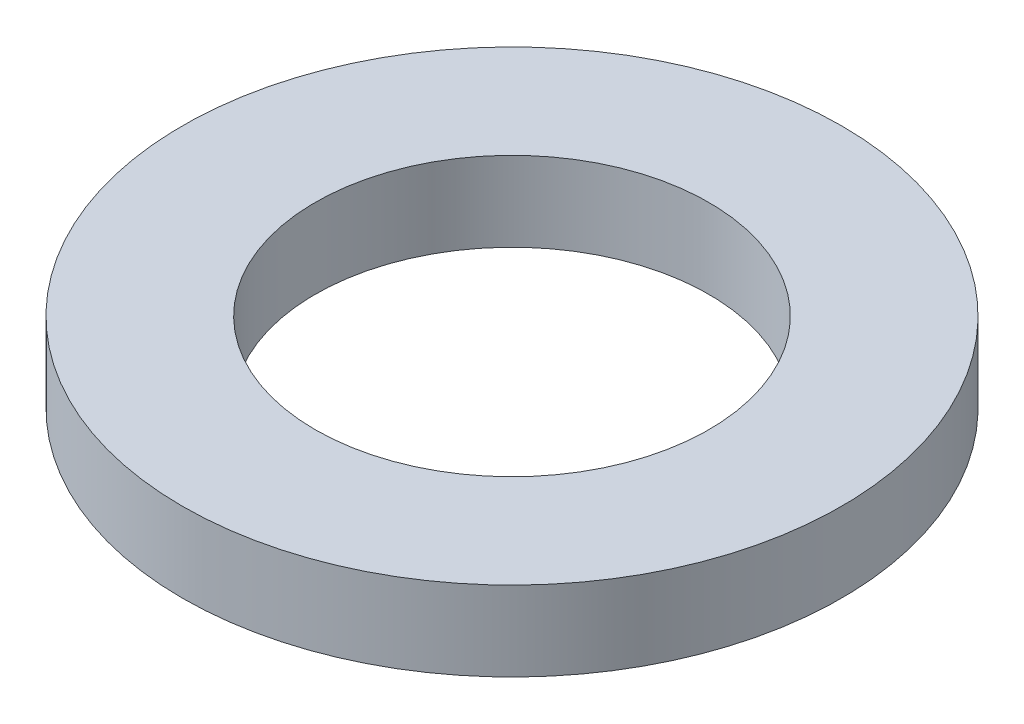
ISO-10303-21;
HEADER;
FILE_DESCRIPTION(('STEP AP214'),'2;1');
FILE_NAME('part.step','',(''),(''),'','','');
FILE_SCHEMA(('AUTOMOTIVE_DESIGN { 1 0 10303 214 1 1 1 1 }'));
ENDSEC;
DATA;
#1=APPLICATION_CONTEXT('core data for automotive mechanical design processes');
#2=APPLICATION_PROTOCOL_DEFINITION('international standard','automotive_design',2000,#1);
#3=PRODUCT_CONTEXT('',#1,'mechanical');
#4=PRODUCT('Part','Part','',(#3));
#5=PRODUCT_RELATED_PRODUCT_CATEGORY('part','',(#4));
#6=PRODUCT_DEFINITION_FORMATION('','',#4);
#7=PRODUCT_DEFINITION_CONTEXT('part definition',#1,'design');
#8=PRODUCT_DEFINITION('design','',#6,#7);
#9=PRODUCT_DEFINITION_SHAPE('','',#8);
#10=(LENGTH_UNIT() NAMED_UNIT(*) SI_UNIT(.MILLI.,.METRE.));
#11=(NAMED_UNIT(*) PLANE_ANGLE_UNIT() SI_UNIT($,.RADIAN.));
#12=(NAMED_UNIT(*) SI_UNIT($,.STERADIAN.) SOLID_ANGLE_UNIT());
#13=UNCERTAINTY_MEASURE_WITH_UNIT(LENGTH_MEASURE(1.E-05),#10,'distance_accuracy_value','');
#14=(GEOMETRIC_REPRESENTATION_CONTEXT(3) GLOBAL_UNCERTAINTY_ASSIGNED_CONTEXT((#13)) GLOBAL_UNIT_ASSIGNED_CONTEXT((#10,
#11,#12)) REPRESENTATION_CONTEXT('',''));
#15=CARTESIAN_POINT('',(0.,0.,0.));
#16=DIRECTION('',(0.,0.,1.));
#17=DIRECTION('',(1.,0.,0.));
#18=AXIS2_PLACEMENT_3D('',#15,#16,#17);
#19=CARTESIAN_POINT('',(0.,0.4572,0.));
#20=DIRECTION('',(0.,-1.,0.));
#21=DIRECTION('',(0.,0.,-1.));
#22=AXIS2_PLACEMENT_3D('',#19,#20,#21);
#23=CYLINDRICAL_SURFACE('',#22,1.8923);
#24=CARTESIAN_POINT('',(0.,0.4572,0.));
#25=DIRECTION('',(0.,1.,0.));
#26=DIRECTION('',(0.,0.,1.));
#27=AXIS2_PLACEMENT_3D('',#24,#25,#26);
#28=CIRCLE('',#27,1.8923);
#29=CARTESIAN_POINT('',(0.,0.4572,1.8923));
#30=VERTEX_POINT('',#29);
#31=EDGE_CURVE('E10',#30,#30,#28,.T.);
#32=ORIENTED_EDGE('',*,*,#31,.F.);
#33=EDGE_LOOP('',(#32));
#34=FACE_BOUND('',#33,.T.);
#35=CARTESIAN_POINT('',(0.,0.,0.));
#36=DIRECTION('',(0.,1.,0.));
#37=DIRECTION('',(0.,0.,1.));
#38=AXIS2_PLACEMENT_3D('',#35,#36,#37);
#39=CIRCLE('',#38,1.8923);
#40=CARTESIAN_POINT('',(0.,0.,1.8923));
#41=VERTEX_POINT('',#40);
#42=EDGE_CURVE('E33',#41,#41,#39,.T.);
#43=ORIENTED_EDGE('',*,*,#42,.T.);
#44=EDGE_LOOP('',(#43));
#45=FACE_BOUND('',#44,.T.);
#46=ADVANCED_FACE('F30',(#34,#45),#23,.T.);
#47=CARTESIAN_POINT('',(0.,0.4572,0.));
#48=DIRECTION('',(0.,1.,0.));
#49=DIRECTION('',(0.,0.,1.));
#50=AXIS2_PLACEMENT_3D('',#47,#48,#49);
#51=PLANE('',#50);
#52=CARTESIAN_POINT('',(0.,0.4572,0.));
#53=DIRECTION('',(0.,1.,0.));
#54=DIRECTION('',(0.,0.,1.));
#55=AXIS2_PLACEMENT_3D('',#52,#53,#54);
#56=CIRCLE('',#55,1.1303);
#57=CARTESIAN_POINT('',(0.,0.4572,1.1303));
#58=VERTEX_POINT('',#57);
#59=EDGE_CURVE('E42',#58,#58,#56,.T.);
#60=ORIENTED_EDGE('',*,*,#59,.F.);
#61=EDGE_LOOP('',(#60));
#62=FACE_BOUND('',#61,.T.);
#63=ORIENTED_EDGE('',*,*,#31,.T.);
#64=EDGE_LOOP('',(#63));
#65=FACE_BOUND('',#64,.T.);
#66=ADVANCED_FACE('F57',(#62,#65),#51,.T.);
#67=CARTESIAN_POINT('',(0.,0.,0.));
#68=DIRECTION('',(0.,1.,0.));
#69=DIRECTION('',(0.,0.,1.));
#70=AXIS2_PLACEMENT_3D('',#67,#68,#69);
#71=PLANE('',#70);
#72=CARTESIAN_POINT('',(0.,0.,0.));
#73=DIRECTION('',(0.,1.,0.));
#74=DIRECTION('',(0.,0.,1.));
#75=AXIS2_PLACEMENT_3D('',#72,#73,#74);
#76=CIRCLE('',#75,1.1303);
#77=CARTESIAN_POINT('',(0.,0.,1.1303));
#78=VERTEX_POINT('',#77);
#79=EDGE_CURVE('E40',#78,#78,#76,.T.);
#80=ORIENTED_EDGE('',*,*,#79,.T.);
#81=EDGE_LOOP('',(#80));
#82=FACE_BOUND('',#81,.T.);
#83=ORIENTED_EDGE('',*,*,#42,.F.);
#84=EDGE_LOOP('',(#83));
#85=FACE_BOUND('',#84,.T.);
#86=ADVANCED_FACE('F48',(#82,#85),#71,.F.);
#87=CARTESIAN_POINT('',(0.,0.,0.));
#88=DIRECTION('',(0.,1.,0.));
#89=DIRECTION('',(0.,0.,1.));
#90=AXIS2_PLACEMENT_3D('',#87,#88,#89);
#91=CYLINDRICAL_SURFACE('',#90,1.1303);
#92=ORIENTED_EDGE('',*,*,#79,.F.);
#93=EDGE_LOOP('',(#92));
#94=FACE_BOUND('',#93,.T.);
#95=ORIENTED_EDGE('',*,*,#59,.T.);
#96=EDGE_LOOP('',(#95));
#97=FACE_BOUND('',#96,.T.);
#98=ADVANCED_FACE('F51',(#94,#97),#91,.F.);
#99=CLOSED_SHELL('',(#46,#66,#86,#98));
#100=MANIFOLD_SOLID_BREP('B2',#99);
#101=ADVANCED_BREP_SHAPE_REPRESENTATION('',(#18,#100),#14);
#102=SHAPE_DEFINITION_REPRESENTATION(#9,#101);
ENDSEC;
END-ISO-10303-21;
